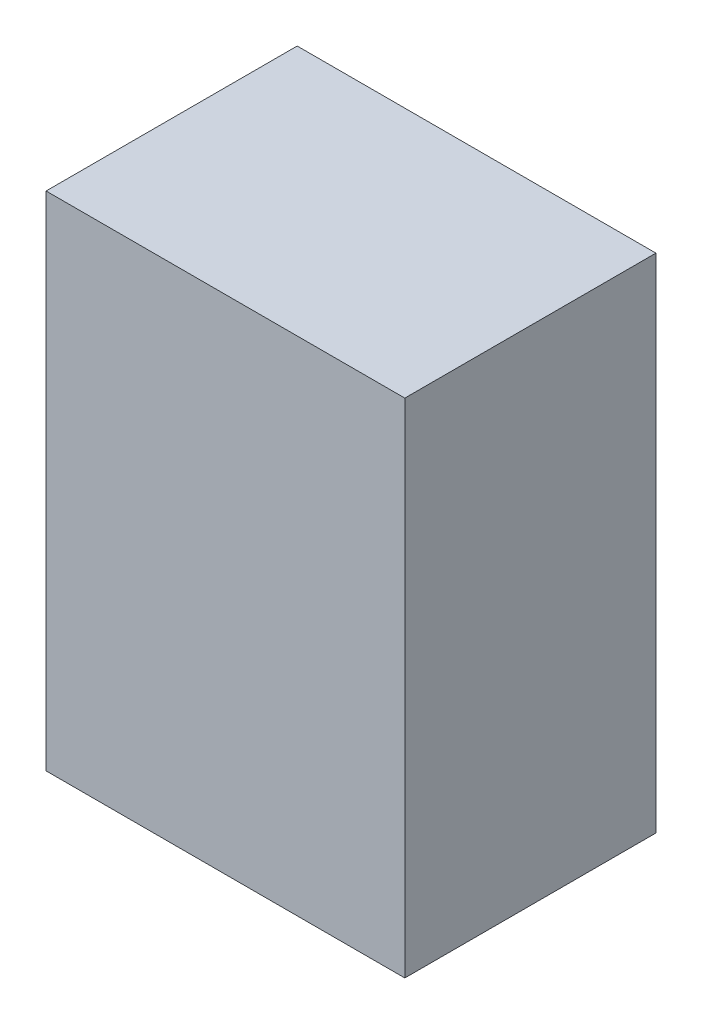
ISO-10303-21;
HEADER;
FILE_DESCRIPTION(('STEP AP214'),'2;1');
FILE_NAME('part.step','',(''),(''),'','','');
FILE_SCHEMA(('AUTOMOTIVE_DESIGN { 1 0 10303 214 1 1 1 1 }'));
ENDSEC;
DATA;
#1=APPLICATION_CONTEXT('core data for automotive mechanical design processes');
#2=APPLICATION_PROTOCOL_DEFINITION('international standard','automotive_design',2000,#1);
#3=PRODUCT_CONTEXT('',#1,'mechanical');
#4=PRODUCT('Part','Part','',(#3));
#5=PRODUCT_RELATED_PRODUCT_CATEGORY('part','',(#4));
#6=PRODUCT_DEFINITION_FORMATION('','',#4);
#7=PRODUCT_DEFINITION_CONTEXT('part definition',#1,'design');
#8=PRODUCT_DEFINITION('design','',#6,#7);
#9=PRODUCT_DEFINITION_SHAPE('','',#8);
#10=(LENGTH_UNIT() NAMED_UNIT(*) SI_UNIT(.MILLI.,.METRE.));
#11=(NAMED_UNIT(*) PLANE_ANGLE_UNIT() SI_UNIT($,.RADIAN.));
#12=(NAMED_UNIT(*) SI_UNIT($,.STERADIAN.) SOLID_ANGLE_UNIT());
#13=UNCERTAINTY_MEASURE_WITH_UNIT(LENGTH_MEASURE(1.E-05),#10,'distance_accuracy_value','');
#14=(GEOMETRIC_REPRESENTATION_CONTEXT(3) GLOBAL_UNCERTAINTY_ASSIGNED_CONTEXT((#13)) GLOBAL_UNIT_ASSIGNED_CONTEXT((#10,
#11,#12)) REPRESENTATION_CONTEXT('',''));
#15=CARTESIAN_POINT('',(0.,0.,0.));
#16=DIRECTION('',(0.,0.,1.));
#17=DIRECTION('',(1.,0.,0.));
#18=AXIS2_PLACEMENT_3D('',#15,#16,#17);
#19=CARTESIAN_POINT('',(0.,0.,7.));
#20=DIRECTION('',(1.,0.,0.));
#21=DIRECTION('',(0.,0.,-1.));
#22=AXIS2_PLACEMENT_3D('',#19,#20,#21);
#23=PLANE('',#22);
#24=DIRECTION('',(0.,-1.,0.));
#25=VECTOR('',#24,1.);
#26=CARTESIAN_POINT('',(0.,0.,0.));
#27=LINE('',#26,#25);
#28=CARTESIAN_POINT('',(0.,14.,0.));
#29=VERTEX_POINT('',#28);
#30=CARTESIAN_POINT('',(0.,0.,0.));
#31=VERTEX_POINT('',#30);
#32=EDGE_CURVE('E108',#29,#31,#27,.T.);
#33=ORIENTED_EDGE('',*,*,#32,.T.);
#34=DIRECTION('',(0.,0.,-1.));
#35=VECTOR('',#34,1.);
#36=CARTESIAN_POINT('',(0.,0.,7.));
#37=LINE('',#36,#35);
#38=CARTESIAN_POINT('',(0.,0.,7.));
#39=VERTEX_POINT('',#38);
#40=EDGE_CURVE('E11',#39,#31,#37,.T.);
#41=ORIENTED_EDGE('',*,*,#40,.F.);
#42=DIRECTION('',(0.,-1.,0.));
#43=VECTOR('',#42,1.);
#44=CARTESIAN_POINT('',(0.,0.,7.));
#45=LINE('',#44,#43);
#46=CARTESIAN_POINT('',(0.,14.,7.));
#47=VERTEX_POINT('',#46);
#48=EDGE_CURVE('E92',#47,#39,#45,.T.);
#49=ORIENTED_EDGE('',*,*,#48,.F.);
#50=DIRECTION('',(0.,0.,-1.));
#51=VECTOR('',#50,1.);
#52=CARTESIAN_POINT('',(0.,14.,7.));
#53=LINE('',#52,#51);
#54=EDGE_CURVE('E105',#47,#29,#53,.T.);
#55=ORIENTED_EDGE('',*,*,#54,.T.);
#56=EDGE_LOOP('',(#33,#41,#49,#55));
#57=FACE_BOUND('',#56,.T.);
#58=ADVANCED_FACE('F43',(#57),#23,.F.);
#59=CARTESIAN_POINT('',(0.,0.,7.));
#60=DIRECTION('',(0.,1.,0.));
#61=DIRECTION('',(0.,0.,1.));
#62=AXIS2_PLACEMENT_3D('',#59,#60,#61);
#63=PLANE('',#62);
#64=DIRECTION('',(1.,0.,0.));
#65=VECTOR('',#64,1.);
#66=CARTESIAN_POINT('',(0.,0.,0.));
#67=LINE('',#66,#65);
#68=CARTESIAN_POINT('',(10.,0.,0.));
#69=VERTEX_POINT('',#68);
#70=EDGE_CURVE('E97',#31,#69,#67,.T.);
#71=ORIENTED_EDGE('',*,*,#70,.T.);
#72=DIRECTION('',(0.,0.,-1.));
#73=VECTOR('',#72,1.);
#74=CARTESIAN_POINT('',(10.,0.,7.));
#75=LINE('',#74,#73);
#76=CARTESIAN_POINT('',(10.,0.,7.));
#77=VERTEX_POINT('',#76);
#78=EDGE_CURVE('E51',#77,#69,#75,.T.);
#79=ORIENTED_EDGE('',*,*,#78,.F.);
#80=DIRECTION('',(1.,0.,0.));
#81=VECTOR('',#80,1.);
#82=CARTESIAN_POINT('',(0.,0.,7.));
#83=LINE('',#82,#81);
#84=EDGE_CURVE('E87',#39,#77,#83,.T.);
#85=ORIENTED_EDGE('',*,*,#84,.F.);
#86=ORIENTED_EDGE('',*,*,#40,.T.);
#87=EDGE_LOOP('',(#71,#79,#85,#86));
#88=FACE_BOUND('',#87,.T.);
#89=ADVANCED_FACE('F100',(#88),#63,.F.);
#90=CARTESIAN_POINT('',(10.,0.,7.));
#91=DIRECTION('',(-1.,0.,0.));
#92=DIRECTION('',(0.,0.,1.));
#93=AXIS2_PLACEMENT_3D('',#90,#91,#92);
#94=PLANE('',#93);
#95=DIRECTION('',(0.,1.,0.));
#96=VECTOR('',#95,1.);
#97=CARTESIAN_POINT('',(10.,0.,0.));
#98=LINE('',#97,#96);
#99=CARTESIAN_POINT('',(10.,14.,0.));
#100=VERTEX_POINT('',#99);
#101=EDGE_CURVE('E78',#69,#100,#98,.T.);
#102=ORIENTED_EDGE('',*,*,#101,.T.);
#103=DIRECTION('',(0.,0.,-1.));
#104=VECTOR('',#103,1.);
#105=CARTESIAN_POINT('',(10.,14.,7.));
#106=LINE('',#105,#104);
#107=CARTESIAN_POINT('',(10.,14.,7.));
#108=VERTEX_POINT('',#107);
#109=EDGE_CURVE('E98',#108,#100,#106,.T.);
#110=ORIENTED_EDGE('',*,*,#109,.F.);
#111=DIRECTION('',(0.,1.,0.));
#112=VECTOR('',#111,1.);
#113=CARTESIAN_POINT('',(10.,0.,7.));
#114=LINE('',#113,#112);
#115=EDGE_CURVE('E95',#77,#108,#114,.T.);
#116=ORIENTED_EDGE('',*,*,#115,.F.);
#117=ORIENTED_EDGE('',*,*,#78,.T.);
#118=EDGE_LOOP('',(#102,#110,#116,#117));
#119=FACE_BOUND('',#118,.T.);
#120=ADVANCED_FACE('F99',(#119),#94,.F.);
#121=CARTESIAN_POINT('',(0.,14.,7.));
#122=DIRECTION('',(0.,-1.,0.));
#123=DIRECTION('',(0.,0.,-1.));
#124=AXIS2_PLACEMENT_3D('',#121,#122,#123);
#125=PLANE('',#124);
#126=DIRECTION('',(-1.,0.,0.));
#127=VECTOR('',#126,1.);
#128=CARTESIAN_POINT('',(0.,14.,0.));
#129=LINE('',#128,#127);
#130=EDGE_CURVE('E85',#100,#29,#129,.T.);
#131=ORIENTED_EDGE('',*,*,#130,.T.);
#132=ORIENTED_EDGE('',*,*,#54,.F.);
#133=DIRECTION('',(-1.,0.,0.));
#134=VECTOR('',#133,1.);
#135=CARTESIAN_POINT('',(0.,14.,7.));
#136=LINE('',#135,#134);
#137=EDGE_CURVE('E56',#108,#47,#136,.T.);
#138=ORIENTED_EDGE('',*,*,#137,.F.);
#139=ORIENTED_EDGE('',*,*,#109,.T.);
#140=EDGE_LOOP('',(#131,#132,#138,#139));
#141=FACE_BOUND('',#140,.T.);
#142=ADVANCED_FACE('F111',(#141),#125,.F.);
#143=CARTESIAN_POINT('',(0.,0.,7.));
#144=DIRECTION('',(0.,0.,-1.));
#145=DIRECTION('',(-1.,0.,0.));
#146=AXIS2_PLACEMENT_3D('',#143,#144,#145);
#147=PLANE('',#146);
#148=ORIENTED_EDGE('',*,*,#48,.T.);
#149=ORIENTED_EDGE('',*,*,#84,.T.);
#150=ORIENTED_EDGE('',*,*,#115,.T.);
#151=ORIENTED_EDGE('',*,*,#137,.T.);
#152=EDGE_LOOP('',(#148,#149,#150,#151));
#153=FACE_BOUND('',#152,.T.);
#154=ADVANCED_FACE('F89',(#153),#147,.F.);
#155=CARTESIAN_POINT('',(0.,0.,0.));
#156=DIRECTION('',(0.,0.,-1.));
#157=DIRECTION('',(-1.,0.,0.));
#158=AXIS2_PLACEMENT_3D('',#155,#156,#157);
#159=PLANE('',#158);
#160=ORIENTED_EDGE('',*,*,#32,.F.);
#161=ORIENTED_EDGE('',*,*,#130,.F.);
#162=ORIENTED_EDGE('',*,*,#101,.F.);
#163=ORIENTED_EDGE('',*,*,#70,.F.);
#164=EDGE_LOOP('',(#160,#161,#162,#163));
#165=FACE_BOUND('',#164,.T.);
#166=ADVANCED_FACE('F118',(#165),#159,.T.);
#167=CLOSED_SHELL('',(#58,#89,#120,#142,#154,#166));
#168=MANIFOLD_SOLID_BREP('B2',#167);
#169=ADVANCED_BREP_SHAPE_REPRESENTATION('',(#18,#168),#14);
#170=SHAPE_DEFINITION_REPRESENTATION(#9,#169);
ENDSEC;
END-ISO-10303-21;
